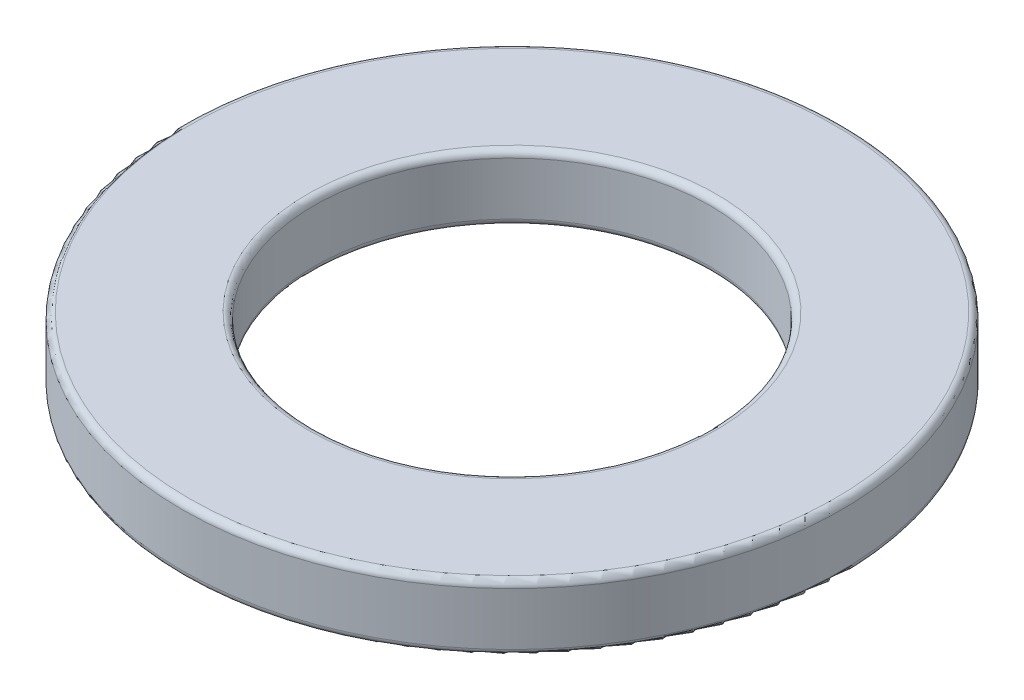
ISO-10303-21;
HEADER;
FILE_DESCRIPTION(('STEP AP214'),'2;1');
FILE_NAME('part.step','',(''),(''),'','','');
FILE_SCHEMA(('AUTOMOTIVE_DESIGN { 1 0 10303 214 1 1 1 1 }'));
ENDSEC;
DATA;
#1=APPLICATION_CONTEXT('core data for automotive mechanical design processes');
#2=APPLICATION_PROTOCOL_DEFINITION('international standard','automotive_design',2000,#1);
#3=PRODUCT_CONTEXT('',#1,'mechanical');
#4=PRODUCT('Part','Part','',(#3));
#5=PRODUCT_RELATED_PRODUCT_CATEGORY('part','',(#4));
#6=PRODUCT_DEFINITION_FORMATION('','',#4);
#7=PRODUCT_DEFINITION_CONTEXT('part definition',#1,'design');
#8=PRODUCT_DEFINITION('design','',#6,#7);
#9=PRODUCT_DEFINITION_SHAPE('','',#8);
#10=(LENGTH_UNIT() NAMED_UNIT(*) SI_UNIT(.MILLI.,.METRE.));
#11=(NAMED_UNIT(*) PLANE_ANGLE_UNIT() SI_UNIT($,.RADIAN.));
#12=(NAMED_UNIT(*) SI_UNIT($,.STERADIAN.) SOLID_ANGLE_UNIT());
#13=UNCERTAINTY_MEASURE_WITH_UNIT(LENGTH_MEASURE(1.E-05),#10,'distance_accuracy_value','');
#14=(GEOMETRIC_REPRESENTATION_CONTEXT(3) GLOBAL_UNCERTAINTY_ASSIGNED_CONTEXT((#13)) GLOBAL_UNIT_ASSIGNED_CONTEXT((#10,
#11,#12)) REPRESENTATION_CONTEXT('',''));
#15=CARTESIAN_POINT('',(0.,0.,0.));
#16=DIRECTION('',(0.,0.,1.));
#17=DIRECTION('',(1.,0.,0.));
#18=AXIS2_PLACEMENT_3D('',#15,#16,#17);
#19=CARTESIAN_POINT('',(0.,2.54,0.));
#20=DIRECTION('',(0.,1.,0.));
#21=DIRECTION('',(0.,0.,1.));
#22=AXIS2_PLACEMENT_3D('',#19,#20,#21);
#23=PLANE('',#22);
#24=CARTESIAN_POINT('',(0.,2.54,0.));
#25=DIRECTION('',(0.,1.,0.));
#26=DIRECTION('',(0.,0.,1.));
#27=AXIS2_PLACEMENT_3D('',#24,#25,#26);
#28=CIRCLE('',#27,7.874);
#29=CARTESIAN_POINT('',(0.,2.54,7.874));
#30=VERTEX_POINT('',#29);
#31=EDGE_CURVE('E10',#30,#30,#28,.F.);
#32=ORIENTED_EDGE('',*,*,#31,.T.);
#33=EDGE_LOOP('',(#32));
#34=FACE_BOUND('',#33,.T.);
#35=CARTESIAN_POINT('',(0.,2.54,0.));
#36=DIRECTION('',(0.,1.,0.));
#37=DIRECTION('',(0.,0.,1.));
#38=AXIS2_PLACEMENT_3D('',#35,#36,#37);
#39=CIRCLE('',#38,12.446);
#40=CARTESIAN_POINT('',(0.,2.54,12.446));
#41=VERTEX_POINT('',#40);
#42=EDGE_CURVE('E40',#41,#41,#39,.T.);
#43=ORIENTED_EDGE('',*,*,#42,.T.);
#44=EDGE_LOOP('',(#43));
#45=FACE_BOUND('',#44,.T.);
#46=ADVANCED_FACE('F33',(#34,#45),#23,.T.);
#47=CARTESIAN_POINT('',(0.,0.,0.));
#48=DIRECTION('',(0.,1.,0.));
#49=DIRECTION('',(0.,0.,1.));
#50=AXIS2_PLACEMENT_3D('',#47,#48,#49);
#51=PLANE('',#50);
#52=CARTESIAN_POINT('',(0.,0.,0.));
#53=DIRECTION('',(0.,1.,0.));
#54=DIRECTION('',(0.,0.,1.));
#55=AXIS2_PLACEMENT_3D('',#52,#53,#54);
#56=CIRCLE('',#55,7.874);
#57=CARTESIAN_POINT('',(0.,0.,7.874));
#58=VERTEX_POINT('',#57);
#59=EDGE_CURVE('E59',#58,#58,#56,.T.);
#60=ORIENTED_EDGE('',*,*,#59,.T.);
#61=EDGE_LOOP('',(#60));
#62=FACE_BOUND('',#61,.T.);
#63=CARTESIAN_POINT('',(0.,0.,0.));
#64=DIRECTION('',(0.,1.,0.));
#65=DIRECTION('',(0.,0.,1.));
#66=AXIS2_PLACEMENT_3D('',#63,#64,#65);
#67=CIRCLE('',#66,12.446);
#68=CARTESIAN_POINT('',(0.,0.,12.446));
#69=VERTEX_POINT('',#68);
#70=EDGE_CURVE('E62',#69,#69,#67,.F.);
#71=ORIENTED_EDGE('',*,*,#70,.T.);
#72=EDGE_LOOP('',(#71));
#73=FACE_BOUND('',#72,.T.);
#74=ADVANCED_FACE('F66',(#62,#73),#51,.F.);
#75=CARTESIAN_POINT('',(0.,2.54,0.));
#76=DIRECTION('',(0.,-1.,0.));
#77=DIRECTION('',(0.,0.,-1.));
#78=AXIS2_PLACEMENT_3D('',#75,#76,#77);
#79=CYLINDRICAL_SURFACE('',#78,12.7);
#80=CARTESIAN_POINT('',(0.,0.254,0.));
#81=DIRECTION('',(0.,1.,0.));
#82=DIRECTION('',(0.,0.,1.));
#83=AXIS2_PLACEMENT_3D('',#80,#81,#82);
#84=CIRCLE('',#83,12.7);
#85=CARTESIAN_POINT('',(0.,0.254,12.7));
#86=VERTEX_POINT('',#85);
#87=EDGE_CURVE('E44',#86,#86,#84,.T.);
#88=ORIENTED_EDGE('',*,*,#87,.T.);
#89=EDGE_LOOP('',(#88));
#90=FACE_BOUND('',#89,.T.);
#91=CARTESIAN_POINT('',(0.,2.286,0.));
#92=DIRECTION('',(0.,1.,0.));
#93=DIRECTION('',(0.,0.,1.));
#94=AXIS2_PLACEMENT_3D('',#91,#92,#93);
#95=CIRCLE('',#94,12.7);
#96=CARTESIAN_POINT('',(0.,2.286,12.7));
#97=VERTEX_POINT('',#96);
#98=EDGE_CURVE('E48',#97,#97,#95,.F.);
#99=ORIENTED_EDGE('',*,*,#98,.T.);
#100=EDGE_LOOP('',(#99));
#101=FACE_BOUND('',#100,.T.);
#102=ADVANCED_FACE('F76',(#90,#101),#79,.T.);
#103=CARTESIAN_POINT('',(0.,2.54,0.));
#104=DIRECTION('',(0.,-1.,0.));
#105=DIRECTION('',(0.,0.,-1.));
#106=AXIS2_PLACEMENT_3D('',#103,#104,#105);
#107=CYLINDRICAL_SURFACE('',#106,7.62);
#108=CARTESIAN_POINT('',(0.,0.254,0.));
#109=DIRECTION('',(0.,1.,0.));
#110=DIRECTION('',(0.,0.,1.));
#111=AXIS2_PLACEMENT_3D('',#108,#109,#110);
#112=CIRCLE('',#111,7.62);
#113=CARTESIAN_POINT('',(0.,0.254,7.62));
#114=VERTEX_POINT('',#113);
#115=EDGE_CURVE('E53',#114,#114,#112,.F.);
#116=ORIENTED_EDGE('',*,*,#115,.T.);
#117=EDGE_LOOP('',(#116));
#118=FACE_BOUND('',#117,.T.);
#119=CARTESIAN_POINT('',(0.,2.286,0.));
#120=DIRECTION('',(0.,1.,0.));
#121=DIRECTION('',(0.,0.,1.));
#122=AXIS2_PLACEMENT_3D('',#119,#120,#121);
#123=CIRCLE('',#122,7.62);
#124=CARTESIAN_POINT('',(0.,2.286,7.62));
#125=VERTEX_POINT('',#124);
#126=EDGE_CURVE('E56',#125,#125,#123,.T.);
#127=ORIENTED_EDGE('',*,*,#126,.T.);
#128=EDGE_LOOP('',(#127));
#129=FACE_BOUND('',#128,.T.);
#130=ADVANCED_FACE('F79',(#118,#129),#107,.F.);
#131=CARTESIAN_POINT('',(0.,0.254,0.));
#132=DIRECTION('',(0.,1.,0.));
#133=DIRECTION('',(0.,0.,1.));
#134=AXIS2_PLACEMENT_3D('',#131,#132,#133);
#135=TOROIDAL_SURFACE('',#134,7.874,0.254);
#136=ORIENTED_EDGE('',*,*,#115,.F.);
#137=EDGE_LOOP('',(#136));
#138=FACE_BOUND('',#137,.T.);
#139=ORIENTED_EDGE('',*,*,#59,.F.);
#140=EDGE_LOOP('',(#139));
#141=FACE_BOUND('',#140,.T.);
#142=ADVANCED_FACE('F72',(#138,#141),#135,.T.);
#143=CARTESIAN_POINT('',(0.,0.254,0.));
#144=DIRECTION('',(0.,1.,0.));
#145=DIRECTION('',(0.,0.,1.));
#146=AXIS2_PLACEMENT_3D('',#143,#144,#145);
#147=TOROIDAL_SURFACE('',#146,12.446,0.254);
#148=ORIENTED_EDGE('',*,*,#70,.F.);
#149=EDGE_LOOP('',(#148));
#150=FACE_BOUND('',#149,.T.);
#151=ORIENTED_EDGE('',*,*,#87,.F.);
#152=EDGE_LOOP('',(#151));
#153=FACE_BOUND('',#152,.T.);
#154=ADVANCED_FACE('F68',(#150,#153),#147,.T.);
#155=CARTESIAN_POINT('',(0.,2.286,0.));
#156=DIRECTION('',(0.,1.,0.));
#157=DIRECTION('',(0.,0.,1.));
#158=AXIS2_PLACEMENT_3D('',#155,#156,#157);
#159=TOROIDAL_SURFACE('',#158,7.874,0.254);
#160=ORIENTED_EDGE('',*,*,#31,.F.);
#161=EDGE_LOOP('',(#160));
#162=FACE_BOUND('',#161,.T.);
#163=ORIENTED_EDGE('',*,*,#126,.F.);
#164=EDGE_LOOP('',(#163));
#165=FACE_BOUND('',#164,.T.);
#166=ADVANCED_FACE('F71',(#162,#165),#159,.T.);
#167=CARTESIAN_POINT('',(0.,2.286,0.));
#168=DIRECTION('',(0.,1.,0.));
#169=DIRECTION('',(0.,0.,1.));
#170=AXIS2_PLACEMENT_3D('',#167,#168,#169);
#171=TOROIDAL_SURFACE('',#170,12.446,0.254);
#172=ORIENTED_EDGE('',*,*,#98,.F.);
#173=EDGE_LOOP('',(#172));
#174=FACE_BOUND('',#173,.T.);
#175=ORIENTED_EDGE('',*,*,#42,.F.);
#176=EDGE_LOOP('',(#175));
#177=FACE_BOUND('',#176,.T.);
#178=ADVANCED_FACE('F35',(#174,#177),#171,.T.);
#179=CLOSED_SHELL('',(#46,#74,#102,#130,#142,#154,#166,#178));
#180=MANIFOLD_SOLID_BREP('B2',#179);
#181=ADVANCED_BREP_SHAPE_REPRESENTATION('',(#18,#180),#14);
#182=SHAPE_DEFINITION_REPRESENTATION(#9,#181);
ENDSEC;
END-ISO-10303-21;
